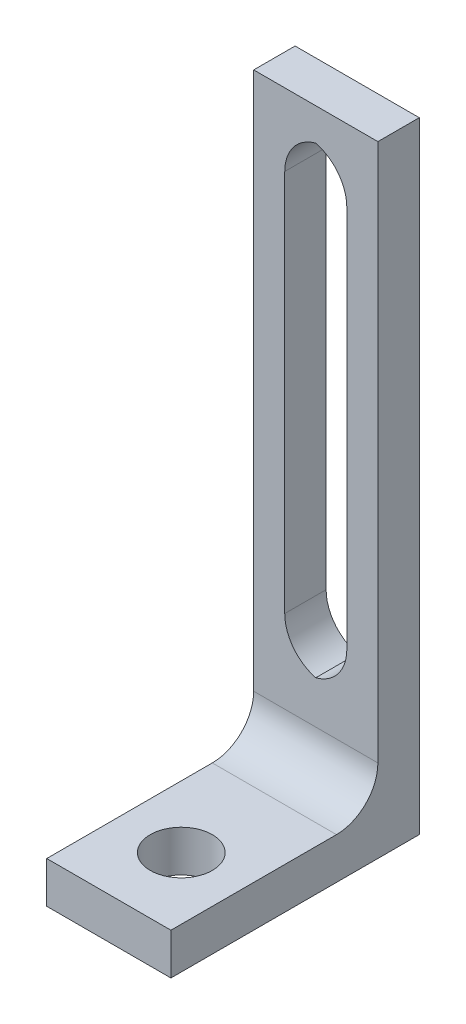
ISO-10303-21;
HEADER;
FILE_DESCRIPTION(('STEP AP214'),'2;1');
FILE_NAME('part.step','',(''),(''),'','','');
FILE_SCHEMA(('AUTOMOTIVE_DESIGN { 1 0 10303 214 1 1 1 1 }'));
ENDSEC;
DATA;
#1=APPLICATION_CONTEXT('core data for automotive mechanical design processes');
#2=APPLICATION_PROTOCOL_DEFINITION('international standard','automotive_design',2000,#1);
#3=PRODUCT_CONTEXT('',#1,'mechanical');
#4=PRODUCT('Part','Part','',(#3));
#5=PRODUCT_RELATED_PRODUCT_CATEGORY('part','',(#4));
#6=PRODUCT_DEFINITION_FORMATION('','',#4);
#7=PRODUCT_DEFINITION_CONTEXT('part definition',#1,'design');
#8=PRODUCT_DEFINITION('design','',#6,#7);
#9=PRODUCT_DEFINITION_SHAPE('','',#8);
#10=(LENGTH_UNIT() NAMED_UNIT(*) SI_UNIT(.MILLI.,.METRE.));
#11=(NAMED_UNIT(*) PLANE_ANGLE_UNIT() SI_UNIT($,.RADIAN.));
#12=(NAMED_UNIT(*) SI_UNIT($,.STERADIAN.) SOLID_ANGLE_UNIT());
#13=UNCERTAINTY_MEASURE_WITH_UNIT(LENGTH_MEASURE(1.E-05),#10,'distance_accuracy_value','');
#14=(GEOMETRIC_REPRESENTATION_CONTEXT(3) GLOBAL_UNCERTAINTY_ASSIGNED_CONTEXT((#13)) GLOBAL_UNIT_ASSIGNED_CONTEXT((#10,
#11,#12)) REPRESENTATION_CONTEXT('',''));
#15=CARTESIAN_POINT('',(0.,0.,0.));
#16=DIRECTION('',(0.,0.,1.));
#17=DIRECTION('',(1.,0.,0.));
#18=AXIS2_PLACEMENT_3D('',#15,#16,#17);
#19=CARTESIAN_POINT('',(0.,0.,2.));
#20=DIRECTION('',(0.,0.,1.));
#21=DIRECTION('',(1.,0.,0.));
#22=AXIS2_PLACEMENT_3D('',#19,#20,#21);
#23=PLANE('',#22);
#24=DIRECTION('',(0.,-1.,0.));
#25=VECTOR('',#24,1.);
#26=CARTESIAN_POINT('',(-3.,15.,2.));
#27=LINE('',#26,#25);
#28=CARTESIAN_POINT('',(-3.,15.,2.));
#29=VERTEX_POINT('',#28);
#30=CARTESIAN_POINT('',(-3.,-11.,2.));
#31=VERTEX_POINT('',#30);
#32=EDGE_CURVE('E206',#29,#31,#27,.T.);
#33=ORIENTED_EDGE('',*,*,#32,.T.);
#34=DIRECTION('',(-1.,0.,0.));
#35=VECTOR('',#34,1.);
#36=CARTESIAN_POINT('',(0.,-11.,2.));
#37=LINE('',#36,#35);
#38=CARTESIAN_POINT('',(3.,-11.,2.));
#39=VERTEX_POINT('',#38);
#40=EDGE_CURVE('E61',#31,#39,#37,.F.);
#41=ORIENTED_EDGE('',*,*,#40,.T.);
#42=DIRECTION('',(0.,1.,0.));
#43=VECTOR('',#42,1.);
#44=CARTESIAN_POINT('',(3.,15.,2.));
#45=LINE('',#44,#43);
#46=CARTESIAN_POINT('',(3.,15.,2.));
#47=VERTEX_POINT('',#46);
#48=EDGE_CURVE('E199',#39,#47,#45,.T.);
#49=ORIENTED_EDGE('',*,*,#48,.T.);
#50=DIRECTION('',(-1.,0.,0.));
#51=VECTOR('',#50,1.);
#52=CARTESIAN_POINT('',(-3.,15.,2.));
#53=LINE('',#52,#51);
#54=EDGE_CURVE('E202',#47,#29,#53,.T.);
#55=ORIENTED_EDGE('',*,*,#54,.T.);
#56=EDGE_LOOP('',(#33,#41,#49,#55));
#57=FACE_BOUND('',#56,.T.);
#58=DIRECTION('',(0.,-1.,0.));
#59=VECTOR('',#58,1.);
#60=CARTESIAN_POINT('',(-1.5,13.5,2.));
#61=LINE('',#60,#59);
#62=CARTESIAN_POINT('',(-1.5,11.5,2.));
#63=VERTEX_POINT('',#62);
#64=CARTESIAN_POINT('',(-1.5,-6.99999999999999,2.));
#65=VERTEX_POINT('',#64);
#66=EDGE_CURVE('E185',#63,#65,#61,.T.);
#67=ORIENTED_EDGE('',*,*,#66,.F.);
#68=CARTESIAN_POINT('',(0.499999999999999,11.5,2.));
#69=DIRECTION('',(0.,0.,1.));
#70=DIRECTION('',(1.,0.,0.));
#71=AXIS2_PLACEMENT_3D('',#68,#69,#70);
#72=CIRCLE('',#71,2.);
#73=CARTESIAN_POINT('',(0.,13.4364916731037,2.));
#74=VERTEX_POINT('',#73);
#75=EDGE_CURVE('E250',#63,#74,#72,.F.);
#76=ORIENTED_EDGE('',*,*,#75,.T.);
#77=CARTESIAN_POINT('',(-0.500000000000001,11.5,2.));
#78=DIRECTION('',(0.,0.,1.));
#79=DIRECTION('',(1.,0.,0.));
#80=AXIS2_PLACEMENT_3D('',#77,#78,#79);
#81=CIRCLE('',#80,2.);
#82=CARTESIAN_POINT('',(1.5,11.5,2.));
#83=VERTEX_POINT('',#82);
#84=EDGE_CURVE('E244',#74,#83,#81,.F.);
#85=ORIENTED_EDGE('',*,*,#84,.T.);
#86=DIRECTION('',(0.,1.,0.));
#87=VECTOR('',#86,1.);
#88=CARTESIAN_POINT('',(1.5,13.5,2.));
#89=LINE('',#88,#87);
#90=CARTESIAN_POINT('',(1.5,-6.99999999999999,2.));
#91=VERTEX_POINT('',#90);
#92=EDGE_CURVE('E181',#91,#83,#89,.T.);
#93=ORIENTED_EDGE('',*,*,#92,.F.);
#94=CARTESIAN_POINT('',(-0.499999999999999,-7.,2.));
#95=DIRECTION('',(0.,0.,1.));
#96=DIRECTION('',(1.,0.,0.));
#97=AXIS2_PLACEMENT_3D('',#94,#95,#96);
#98=CIRCLE('',#97,2.);
#99=CARTESIAN_POINT('',(0.,-8.93649167310371,2.));
#100=VERTEX_POINT('',#99);
#101=EDGE_CURVE('E256',#91,#100,#98,.F.);
#102=ORIENTED_EDGE('',*,*,#101,.T.);
#103=CARTESIAN_POINT('',(0.500000000000001,-7.,2.));
#104=DIRECTION('',(0.,0.,1.));
#105=DIRECTION('',(1.,0.,0.));
#106=AXIS2_PLACEMENT_3D('',#103,#104,#105);
#107=CIRCLE('',#106,2.);
#108=EDGE_CURVE('E262',#100,#65,#107,.F.);
#109=ORIENTED_EDGE('',*,*,#108,.T.);
#110=EDGE_LOOP('',(#67,#76,#85,#93,#102,#109));
#111=FACE_BOUND('',#110,.T.);
#112=ADVANCED_FACE('F39',(#57,#111),#23,.T.);
#113=CARTESIAN_POINT('',(0.,0.,0.));
#114=DIRECTION('',(0.,0.,1.));
#115=DIRECTION('',(1.,0.,0.));
#116=AXIS2_PLACEMENT_3D('',#113,#114,#115);
#117=PLANE('',#116);
#118=DIRECTION('',(0.,1.,0.));
#119=VECTOR('',#118,1.);
#120=CARTESIAN_POINT('',(3.,15.,0.));
#121=LINE('',#120,#119);
#122=CARTESIAN_POINT('',(3.,-15.,0.));
#123=VERTEX_POINT('',#122);
#124=CARTESIAN_POINT('',(3.,15.,0.));
#125=VERTEX_POINT('',#124);
#126=EDGE_CURVE('E190',#123,#125,#121,.T.);
#127=ORIENTED_EDGE('',*,*,#126,.F.);
#128=DIRECTION('',(1.,0.,0.));
#129=VECTOR('',#128,1.);
#130=CARTESIAN_POINT('',(-3.,-15.,0.));
#131=LINE('',#130,#129);
#132=CARTESIAN_POINT('',(-3.,-15.,0.));
#133=VERTEX_POINT('',#132);
#134=EDGE_CURVE('E203',#133,#123,#131,.T.);
#135=ORIENTED_EDGE('',*,*,#134,.F.);
#136=DIRECTION('',(0.,-1.,0.));
#137=VECTOR('',#136,1.);
#138=CARTESIAN_POINT('',(-3.,15.,0.));
#139=LINE('',#138,#137);
#140=CARTESIAN_POINT('',(-3.,15.,0.));
#141=VERTEX_POINT('',#140);
#142=EDGE_CURVE('E140',#141,#133,#139,.T.);
#143=ORIENTED_EDGE('',*,*,#142,.F.);
#144=DIRECTION('',(-1.,0.,0.));
#145=VECTOR('',#144,1.);
#146=CARTESIAN_POINT('',(-3.,15.,0.));
#147=LINE('',#146,#145);
#148=EDGE_CURVE('E212',#125,#141,#147,.T.);
#149=ORIENTED_EDGE('',*,*,#148,.F.);
#150=EDGE_LOOP('',(#127,#135,#143,#149));
#151=FACE_BOUND('',#150,.T.);
#152=DIRECTION('',(0.,-1.,0.));
#153=VECTOR('',#152,1.);
#154=CARTESIAN_POINT('',(-1.5,13.5,0.));
#155=LINE('',#154,#153);
#156=CARTESIAN_POINT('',(-1.5,11.5,0.));
#157=VERTEX_POINT('',#156);
#158=CARTESIAN_POINT('',(-1.5,-6.99999999999999,0.));
#159=VERTEX_POINT('',#158);
#160=EDGE_CURVE('E186',#157,#159,#155,.T.);
#161=ORIENTED_EDGE('',*,*,#160,.T.);
#162=CARTESIAN_POINT('',(0.500000000000001,-7.,0.));
#163=DIRECTION('',(0.,0.,1.));
#164=DIRECTION('',(1.,0.,0.));
#165=AXIS2_PLACEMENT_3D('',#162,#163,#164);
#166=CIRCLE('',#165,2.);
#167=CARTESIAN_POINT('',(0.,-8.93649167310371,0.));
#168=VERTEX_POINT('',#167);
#169=EDGE_CURVE('E259',#159,#168,#166,.T.);
#170=ORIENTED_EDGE('',*,*,#169,.T.);
#171=CARTESIAN_POINT('',(-0.499999999999999,-7.,0.));
#172=DIRECTION('',(0.,0.,1.));
#173=DIRECTION('',(1.,0.,0.));
#174=AXIS2_PLACEMENT_3D('',#171,#172,#173);
#175=CIRCLE('',#174,2.);
#176=CARTESIAN_POINT('',(1.5,-6.99999999999999,0.));
#177=VERTEX_POINT('',#176);
#178=EDGE_CURVE('E253',#168,#177,#175,.T.);
#179=ORIENTED_EDGE('',*,*,#178,.T.);
#180=DIRECTION('',(0.,1.,0.));
#181=VECTOR('',#180,1.);
#182=CARTESIAN_POINT('',(1.5,13.5,0.));
#183=LINE('',#182,#181);
#184=CARTESIAN_POINT('',(1.5,11.5,0.));
#185=VERTEX_POINT('',#184);
#186=EDGE_CURVE('E191',#177,#185,#183,.T.);
#187=ORIENTED_EDGE('',*,*,#186,.T.);
#188=CARTESIAN_POINT('',(-0.500000000000001,11.5,0.));
#189=DIRECTION('',(0.,0.,1.));
#190=DIRECTION('',(1.,0.,0.));
#191=AXIS2_PLACEMENT_3D('',#188,#189,#190);
#192=CIRCLE('',#191,2.);
#193=CARTESIAN_POINT('',(0.,13.4364916731037,0.));
#194=VERTEX_POINT('',#193);
#195=EDGE_CURVE('E241',#185,#194,#192,.T.);
#196=ORIENTED_EDGE('',*,*,#195,.T.);
#197=CARTESIAN_POINT('',(0.499999999999999,11.5,0.));
#198=DIRECTION('',(0.,0.,1.));
#199=DIRECTION('',(1.,0.,0.));
#200=AXIS2_PLACEMENT_3D('',#197,#198,#199);
#201=CIRCLE('',#200,2.);
#202=EDGE_CURVE('E247',#194,#157,#201,.T.);
#203=ORIENTED_EDGE('',*,*,#202,.T.);
#204=EDGE_LOOP('',(#161,#170,#179,#187,#196,#203));
#205=FACE_BOUND('',#204,.T.);
#206=ADVANCED_FACE('F293',(#151,#205),#117,.F.);
#207=CARTESIAN_POINT('',(3.,15.,2.));
#208=DIRECTION('',(-1.,0.,0.));
#209=DIRECTION('',(0.,-1.,0.));
#210=AXIS2_PLACEMENT_3D('',#207,#208,#209);
#211=PLANE('',#210);
#212=ORIENTED_EDGE('',*,*,#126,.T.);
#213=DIRECTION('',(0.,0.,-1.));
#214=VECTOR('',#213,1.);
#215=CARTESIAN_POINT('',(3.,15.,2.));
#216=LINE('',#215,#214);
#217=EDGE_CURVE('E223',#47,#125,#216,.T.);
#218=ORIENTED_EDGE('',*,*,#217,.F.);
#219=ORIENTED_EDGE('',*,*,#48,.F.);
#220=CARTESIAN_POINT('',(3.,-11.,4.));
#221=DIRECTION('',(-1.,0.,0.));
#222=DIRECTION('',(0.,-1.,0.));
#223=AXIS2_PLACEMENT_3D('',#220,#221,#222);
#224=CIRCLE('',#223,2.);
#225=CARTESIAN_POINT('',(3.,-13.,4.));
#226=VERTEX_POINT('',#225);
#227=EDGE_CURVE('E11',#39,#226,#224,.T.);
#228=ORIENTED_EDGE('',*,*,#227,.T.);
#229=DIRECTION('',(0.,0.,-1.));
#230=VECTOR('',#229,1.);
#231=CARTESIAN_POINT('',(3.,-13.,12.));
#232=LINE('',#231,#230);
#233=CARTESIAN_POINT('',(3.,-13.,12.));
#234=VERTEX_POINT('',#233);
#235=EDGE_CURVE('E176',#234,#226,#232,.T.);
#236=ORIENTED_EDGE('',*,*,#235,.F.);
#237=DIRECTION('',(0.,1.,0.));
#238=VECTOR('',#237,1.);
#239=CARTESIAN_POINT('',(3.,-15.,12.));
#240=LINE('',#239,#238);
#241=CARTESIAN_POINT('',(3.,-15.,12.));
#242=VERTEX_POINT('',#241);
#243=EDGE_CURVE('E154',#242,#234,#240,.T.);
#244=ORIENTED_EDGE('',*,*,#243,.F.);
#245=DIRECTION('',(0.,0.,-1.));
#246=VECTOR('',#245,1.);
#247=CARTESIAN_POINT('',(3.,-15.,2.));
#248=LINE('',#247,#246);
#249=EDGE_CURVE('E145',#242,#123,#248,.T.);
#250=ORIENTED_EDGE('',*,*,#249,.T.);
#251=EDGE_LOOP('',(#212,#218,#219,#228,#236,#244,#250));
#252=FACE_BOUND('',#251,.T.);
#253=ADVANCED_FACE('F284',(#252),#211,.F.);
#254=CARTESIAN_POINT('',(-3.,15.,2.));
#255=DIRECTION('',(0.,-1.,0.));
#256=DIRECTION('',(0.,0.,-1.));
#257=AXIS2_PLACEMENT_3D('',#254,#255,#256);
#258=PLANE('',#257);
#259=ORIENTED_EDGE('',*,*,#148,.T.);
#260=DIRECTION('',(0.,0.,-1.));
#261=VECTOR('',#260,1.);
#262=CARTESIAN_POINT('',(-3.,15.,2.));
#263=LINE('',#262,#261);
#264=EDGE_CURVE('E144',#29,#141,#263,.T.);
#265=ORIENTED_EDGE('',*,*,#264,.F.);
#266=ORIENTED_EDGE('',*,*,#54,.F.);
#267=ORIENTED_EDGE('',*,*,#217,.T.);
#268=EDGE_LOOP('',(#259,#265,#266,#267));
#269=FACE_BOUND('',#268,.T.);
#270=ADVANCED_FACE('F290',(#269),#258,.F.);
#271=CARTESIAN_POINT('',(-3.,15.,2.));
#272=DIRECTION('',(1.,0.,0.));
#273=DIRECTION('',(0.,1.,0.));
#274=AXIS2_PLACEMENT_3D('',#271,#272,#273);
#275=PLANE('',#274);
#276=ORIENTED_EDGE('',*,*,#142,.T.);
#277=DIRECTION('',(0.,0.,-1.));
#278=VECTOR('',#277,1.);
#279=CARTESIAN_POINT('',(-3.,-15.,2.));
#280=LINE('',#279,#278);
#281=CARTESIAN_POINT('',(-3.,-15.,12.));
#282=VERTEX_POINT('',#281);
#283=EDGE_CURVE('E133',#282,#133,#280,.T.);
#284=ORIENTED_EDGE('',*,*,#283,.F.);
#285=DIRECTION('',(0.,-1.,0.));
#286=VECTOR('',#285,1.);
#287=CARTESIAN_POINT('',(-3.,-15.,12.));
#288=LINE('',#287,#286);
#289=CARTESIAN_POINT('',(-3.,-13.,12.));
#290=VERTEX_POINT('',#289);
#291=EDGE_CURVE('E137',#290,#282,#288,.T.);
#292=ORIENTED_EDGE('',*,*,#291,.F.);
#293=DIRECTION('',(0.,0.,-1.));
#294=VECTOR('',#293,1.);
#295=CARTESIAN_POINT('',(-3.,-13.,12.));
#296=LINE('',#295,#294);
#297=CARTESIAN_POINT('',(-3.,-13.,4.));
#298=VERTEX_POINT('',#297);
#299=EDGE_CURVE('E173',#290,#298,#296,.T.);
#300=ORIENTED_EDGE('',*,*,#299,.T.);
#301=CARTESIAN_POINT('',(-3.,-11.,4.));
#302=DIRECTION('',(1.,0.,0.));
#303=DIRECTION('',(0.,1.,0.));
#304=AXIS2_PLACEMENT_3D('',#301,#302,#303);
#305=CIRCLE('',#304,2.);
#306=EDGE_CURVE('E48',#298,#31,#305,.T.);
#307=ORIENTED_EDGE('',*,*,#306,.T.);
#308=ORIENTED_EDGE('',*,*,#32,.F.);
#309=ORIENTED_EDGE('',*,*,#264,.T.);
#310=EDGE_LOOP('',(#276,#284,#292,#300,#307,#308,#309));
#311=FACE_BOUND('',#310,.T.);
#312=ADVANCED_FACE('F135',(#311),#275,.F.);
#313=CARTESIAN_POINT('',(-3.,-15.,2.));
#314=DIRECTION('',(0.,1.,0.));
#315=DIRECTION('',(0.,0.,1.));
#316=AXIS2_PLACEMENT_3D('',#313,#314,#315);
#317=PLANE('',#316);
#318=CARTESIAN_POINT('',(0.,-15.,8.5));
#319=DIRECTION('',(0.,1.,0.));
#320=DIRECTION('',(0.,0.,1.));
#321=AXIS2_PLACEMENT_3D('',#318,#319,#320);
#322=CIRCLE('',#321,1.5);
#323=CARTESIAN_POINT('',(0.,-15.,10.));
#324=VERTEX_POINT('',#323);
#325=EDGE_CURVE('E161',#324,#324,#322,.T.);
#326=ORIENTED_EDGE('',*,*,#325,.T.);
#327=EDGE_LOOP('',(#326));
#328=FACE_BOUND('',#327,.T.);
#329=ORIENTED_EDGE('',*,*,#134,.T.);
#330=ORIENTED_EDGE('',*,*,#249,.F.);
#331=DIRECTION('',(1.,0.,0.));
#332=VECTOR('',#331,1.);
#333=CARTESIAN_POINT('',(-3.,-15.,12.));
#334=LINE('',#333,#332);
#335=EDGE_CURVE('E148',#282,#242,#334,.T.);
#336=ORIENTED_EDGE('',*,*,#335,.F.);
#337=ORIENTED_EDGE('',*,*,#283,.T.);
#338=EDGE_LOOP('',(#329,#330,#336,#337));
#339=FACE_BOUND('',#338,.T.);
#340=ADVANCED_FACE('F149',(#328,#339),#317,.F.);
#341=CARTESIAN_POINT('',(1.5,13.5,2.));
#342=DIRECTION('',(-1.,0.,0.));
#343=DIRECTION('',(0.,-1.,0.));
#344=AXIS2_PLACEMENT_3D('',#341,#342,#343);
#345=PLANE('',#344);
#346=ORIENTED_EDGE('',*,*,#92,.T.);
#347=DIRECTION('',(0.,0.,-1.));
#348=VECTOR('',#347,1.);
#349=CARTESIAN_POINT('',(1.5,11.5,0.));
#350=LINE('',#349,#348);
#351=EDGE_CURVE('E231',#83,#185,#350,.T.);
#352=ORIENTED_EDGE('',*,*,#351,.T.);
#353=ORIENTED_EDGE('',*,*,#186,.F.);
#354=DIRECTION('',(0.,0.,-1.));
#355=VECTOR('',#354,1.);
#356=CARTESIAN_POINT('',(1.5,-7.,2.));
#357=LINE('',#356,#355);
#358=EDGE_CURVE('E227',#177,#91,#357,.F.);
#359=ORIENTED_EDGE('',*,*,#358,.T.);
#360=EDGE_LOOP('',(#346,#352,#353,#359));
#361=FACE_BOUND('',#360,.T.);
#362=ADVANCED_FACE('F313',(#361),#345,.T.);
#363=CARTESIAN_POINT('',(-1.5,13.5,2.));
#364=DIRECTION('',(1.,0.,0.));
#365=DIRECTION('',(0.,1.,0.));
#366=AXIS2_PLACEMENT_3D('',#363,#364,#365);
#367=PLANE('',#366);
#368=ORIENTED_EDGE('',*,*,#160,.F.);
#369=DIRECTION('',(0.,0.,-1.));
#370=VECTOR('',#369,1.);
#371=CARTESIAN_POINT('',(-1.5,11.5,2.));
#372=LINE('',#371,#370);
#373=EDGE_CURVE('E238',#157,#63,#372,.F.);
#374=ORIENTED_EDGE('',*,*,#373,.T.);
#375=ORIENTED_EDGE('',*,*,#66,.T.);
#376=DIRECTION('',(0.,0.,-1.));
#377=VECTOR('',#376,1.);
#378=CARTESIAN_POINT('',(-1.5,-7.,0.));
#379=LINE('',#378,#377);
#380=EDGE_CURVE('E235',#65,#159,#379,.T.);
#381=ORIENTED_EDGE('',*,*,#380,.T.);
#382=EDGE_LOOP('',(#368,#374,#375,#381));
#383=FACE_BOUND('',#382,.T.);
#384=ADVANCED_FACE('F324',(#383),#367,.T.);
#385=CARTESIAN_POINT('',(0.499999999999999,11.5,2.));
#386=DIRECTION('',(0.,0.,1.));
#387=DIRECTION('',(1.,0.,0.));
#388=AXIS2_PLACEMENT_3D('',#385,#386,#387);
#389=CYLINDRICAL_SURFACE('',#388,2.);
#390=DIRECTION('',(0.,0.,1.));
#391=VECTOR('',#390,1.);
#392=CARTESIAN_POINT('',(0.,13.4364916731037,1.));
#393=LINE('',#392,#391);
#394=EDGE_CURVE('E195',#74,#194,#393,.F.);
#395=ORIENTED_EDGE('',*,*,#394,.F.);
#396=ORIENTED_EDGE('',*,*,#75,.F.);
#397=ORIENTED_EDGE('',*,*,#373,.F.);
#398=ORIENTED_EDGE('',*,*,#202,.F.);
#399=EDGE_LOOP('',(#395,#396,#397,#398));
#400=FACE_BOUND('',#399,.T.);
#401=ADVANCED_FACE('F321',(#400),#389,.F.);
#402=CARTESIAN_POINT('',(-0.500000000000001,11.5,2.));
#403=DIRECTION('',(0.,0.,1.));
#404=DIRECTION('',(1.,0.,0.));
#405=AXIS2_PLACEMENT_3D('',#402,#403,#404);
#406=CYLINDRICAL_SURFACE('',#405,2.);
#407=ORIENTED_EDGE('',*,*,#84,.F.);
#408=ORIENTED_EDGE('',*,*,#394,.T.);
#409=ORIENTED_EDGE('',*,*,#195,.F.);
#410=ORIENTED_EDGE('',*,*,#351,.F.);
#411=EDGE_LOOP('',(#407,#408,#409,#410));
#412=FACE_BOUND('',#411,.T.);
#413=ADVANCED_FACE('F318',(#412),#406,.F.);
#414=CARTESIAN_POINT('',(0.500000000000001,-7.,2.));
#415=DIRECTION('',(0.,0.,1.));
#416=DIRECTION('',(1.,0.,0.));
#417=AXIS2_PLACEMENT_3D('',#414,#415,#416);
#418=CYLINDRICAL_SURFACE('',#417,2.);
#419=ORIENTED_EDGE('',*,*,#380,.F.);
#420=ORIENTED_EDGE('',*,*,#108,.F.);
#421=DIRECTION('',(0.,0.,1.));
#422=VECTOR('',#421,1.);
#423=CARTESIAN_POINT('',(0.,-8.93649167310371,1.));
#424=LINE('',#423,#422);
#425=EDGE_CURVE('E180',#168,#100,#424,.T.);
#426=ORIENTED_EDGE('',*,*,#425,.F.);
#427=ORIENTED_EDGE('',*,*,#169,.F.);
#428=EDGE_LOOP('',(#419,#420,#426,#427));
#429=FACE_BOUND('',#428,.T.);
#430=ADVANCED_FACE('F305',(#429),#418,.F.);
#431=CARTESIAN_POINT('',(-0.499999999999999,-7.,2.));
#432=DIRECTION('',(0.,0.,1.));
#433=DIRECTION('',(1.,0.,0.));
#434=AXIS2_PLACEMENT_3D('',#431,#432,#433);
#435=CYLINDRICAL_SURFACE('',#434,2.);
#436=ORIENTED_EDGE('',*,*,#101,.F.);
#437=ORIENTED_EDGE('',*,*,#358,.F.);
#438=ORIENTED_EDGE('',*,*,#178,.F.);
#439=ORIENTED_EDGE('',*,*,#425,.T.);
#440=EDGE_LOOP('',(#436,#437,#438,#439));
#441=FACE_BOUND('',#440,.T.);
#442=ADVANCED_FACE('F310',(#441),#435,.F.);
#443=CARTESIAN_POINT('',(-3.,-13.,12.));
#444=DIRECTION('',(0.,-1.,0.));
#445=DIRECTION('',(0.,0.,-1.));
#446=AXIS2_PLACEMENT_3D('',#443,#444,#445);
#447=PLANE('',#446);
#448=CARTESIAN_POINT('',(0.,-13.,8.5));
#449=DIRECTION('',(0.,1.,0.));
#450=DIRECTION('',(0.,0.,1.));
#451=AXIS2_PLACEMENT_3D('',#448,#449,#450);
#452=CIRCLE('',#451,1.5);
#453=CARTESIAN_POINT('',(0.,-13.,10.));
#454=VERTEX_POINT('',#453);
#455=EDGE_CURVE('E165',#454,#454,#452,.T.);
#456=ORIENTED_EDGE('',*,*,#455,.F.);
#457=EDGE_LOOP('',(#456));
#458=FACE_BOUND('',#457,.T.);
#459=ORIENTED_EDGE('',*,*,#235,.T.);
#460=DIRECTION('',(-1.,0.,0.));
#461=VECTOR('',#460,1.);
#462=CARTESIAN_POINT('',(-3.,-13.,4.));
#463=LINE('',#462,#461);
#464=EDGE_CURVE('E265',#226,#298,#463,.T.);
#465=ORIENTED_EDGE('',*,*,#464,.T.);
#466=ORIENTED_EDGE('',*,*,#299,.F.);
#467=DIRECTION('',(-1.,0.,0.));
#468=VECTOR('',#467,1.);
#469=CARTESIAN_POINT('',(-3.,-13.,12.));
#470=LINE('',#469,#468);
#471=EDGE_CURVE('E158',#234,#290,#470,.T.);
#472=ORIENTED_EDGE('',*,*,#471,.F.);
#473=EDGE_LOOP('',(#459,#465,#466,#472));
#474=FACE_BOUND('',#473,.T.);
#475=ADVANCED_FACE('F279',(#458,#474),#447,.F.);
#476=CARTESIAN_POINT('',(0.,0.,12.));
#477=DIRECTION('',(0.,0.,-1.));
#478=DIRECTION('',(-1.,0.,0.));
#479=AXIS2_PLACEMENT_3D('',#476,#477,#478);
#480=PLANE('',#479);
#481=ORIENTED_EDGE('',*,*,#291,.T.);
#482=ORIENTED_EDGE('',*,*,#335,.T.);
#483=ORIENTED_EDGE('',*,*,#243,.T.);
#484=ORIENTED_EDGE('',*,*,#471,.T.);
#485=EDGE_LOOP('',(#481,#482,#483,#484));
#486=FACE_BOUND('',#485,.T.);
#487=ADVANCED_FACE('F156',(#486),#480,.F.);
#488=CARTESIAN_POINT('',(-3.,-11.,4.));
#489=DIRECTION('',(-1.,0.,0.));
#490=DIRECTION('',(0.,0.,1.));
#491=AXIS2_PLACEMENT_3D('',#488,#489,#490);
#492=CYLINDRICAL_SURFACE('',#491,2.);
#493=ORIENTED_EDGE('',*,*,#227,.F.);
#494=ORIENTED_EDGE('',*,*,#40,.F.);
#495=ORIENTED_EDGE('',*,*,#306,.F.);
#496=ORIENTED_EDGE('',*,*,#464,.F.);
#497=EDGE_LOOP('',(#493,#494,#495,#496));
#498=FACE_BOUND('',#497,.T.);
#499=ADVANCED_FACE('F41',(#498),#492,.F.);
#500=CARTESIAN_POINT('',(0.,-23.,8.5));
#501=DIRECTION('',(0.,1.,0.));
#502=DIRECTION('',(0.,0.,1.));
#503=AXIS2_PLACEMENT_3D('',#500,#501,#502);
#504=CYLINDRICAL_SURFACE('',#503,1.5);
#505=ORIENTED_EDGE('',*,*,#455,.T.);
#506=EDGE_LOOP('',(#505));
#507=FACE_BOUND('',#506,.T.);
#508=ORIENTED_EDGE('',*,*,#325,.F.);
#509=EDGE_LOOP('',(#508));
#510=FACE_BOUND('',#509,.T.);
#511=ADVANCED_FACE('F376',(#507,#510),#504,.F.);
#512=CLOSED_SHELL('',(#112,#206,#253,#270,#312,#340,#362,#384,#401,#413,#430,#442,#475,#487,
#499,#511));
#513=MANIFOLD_SOLID_BREP('B2',#512);
#514=ADVANCED_BREP_SHAPE_REPRESENTATION('',(#18,#513),#14);
#515=SHAPE_DEFINITION_REPRESENTATION(#9,#514);
ENDSEC;
END-ISO-10303-21;
